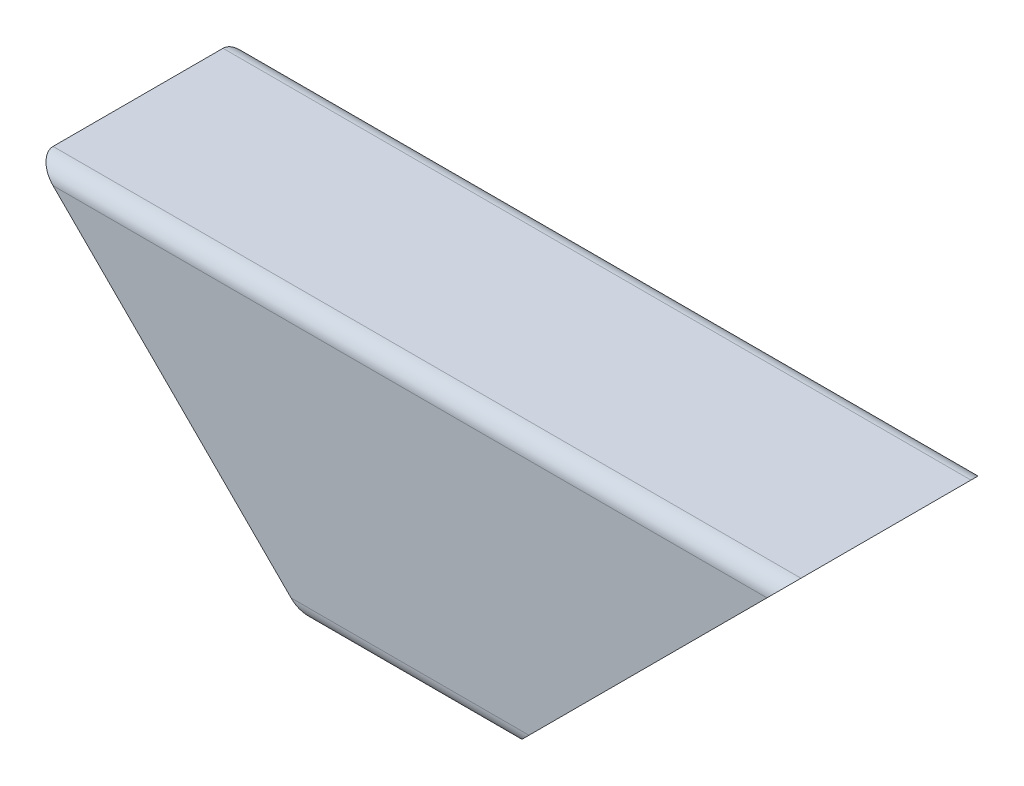
ISO-10303-21;
HEADER;
FILE_DESCRIPTION(('STEP AP214'),'2;1');
FILE_NAME('part.step','',(''),(''),'','','');
FILE_SCHEMA(('AUTOMOTIVE_DESIGN { 1 0 10303 214 1 1 1 1 }'));
ENDSEC;
DATA;
#1=APPLICATION_CONTEXT('core data for automotive mechanical design processes');
#2=APPLICATION_PROTOCOL_DEFINITION('international standard','automotive_design',2000,#1);
#3=PRODUCT_CONTEXT('',#1,'mechanical');
#4=PRODUCT('Part','Part','',(#3));
#5=PRODUCT_RELATED_PRODUCT_CATEGORY('part','',(#4));
#6=PRODUCT_DEFINITION_FORMATION('','',#4);
#7=PRODUCT_DEFINITION_CONTEXT('part definition',#1,'design');
#8=PRODUCT_DEFINITION('design','',#6,#7);
#9=PRODUCT_DEFINITION_SHAPE('','',#8);
#10=(LENGTH_UNIT() NAMED_UNIT(*) SI_UNIT(.MILLI.,.METRE.));
#11=(NAMED_UNIT(*) PLANE_ANGLE_UNIT() SI_UNIT($,.RADIAN.));
#12=(NAMED_UNIT(*) SI_UNIT($,.STERADIAN.) SOLID_ANGLE_UNIT());
#13=UNCERTAINTY_MEASURE_WITH_UNIT(LENGTH_MEASURE(1.E-05),#10,'distance_accuracy_value','');
#14=(GEOMETRIC_REPRESENTATION_CONTEXT(3) GLOBAL_UNCERTAINTY_ASSIGNED_CONTEXT((#13)) GLOBAL_UNIT_ASSIGNED_CONTEXT((#10,
#11,#12)) REPRESENTATION_CONTEXT('',''));
#15=CARTESIAN_POINT('',(0.,0.,0.));
#16=DIRECTION('',(0.,0.,1.));
#17=DIRECTION('',(1.,0.,0.));
#18=AXIS2_PLACEMENT_3D('',#15,#16,#17);
#19=CARTESIAN_POINT('',(139.7,34.2808256510846,71.6854824043168));
#20=DIRECTION('',(-1.,0.,0.));
#21=DIRECTION('',(0.,0.,1.));
#22=AXIS2_PLACEMENT_3D('',#19,#20,#21);
#23=CYLINDRICAL_SURFACE('',#22,3.175);
#24=DIRECTION('',(-1.,0.,0.));
#25=VECTOR('',#24,1.);
#26=CARTESIAN_POINT('',(139.7,34.2808256510845,74.8604824043168));
#27=LINE('',#26,#25);
#28=CARTESIAN_POINT('',(136.525,34.2808256510845,74.8604824043168));
#29=VERTEX_POINT('',#28);
#30=CARTESIAN_POINT('',(3.17499999999998,34.2808256510846,74.8604824043168));
#31=VERTEX_POINT('',#30);
#32=EDGE_CURVE('E212',#29,#31,#27,.T.);
#33=ORIENTED_EDGE('',*,*,#32,.F.);
#34=CARTESIAN_POINT('',(136.525,34.2808256510846,71.6854824043168));
#35=DIRECTION('',(-0.707106781186547,0.707106781186548,0.));
#36=DIRECTION('',(-0.707106781186548,-0.707106781186547,0.));
#37=AXIS2_PLACEMENT_3D('',#34,#35,#36);
#38=ELLIPSE('',#37,4.49012806053457,3.175);
#39=CARTESIAN_POINT('',(139.7,37.4558256510846,71.6854824043168));
#40=VERTEX_POINT('',#39);
#41=EDGE_CURVE('E194',#29,#40,#38,.T.);
#42=ORIENTED_EDGE('',*,*,#41,.T.);
#43=DIRECTION('',(-1.,0.,0.));
#44=VECTOR('',#43,1.);
#45=CARTESIAN_POINT('',(139.7,37.4558256510846,71.6854824043168));
#46=LINE('',#45,#44);
#47=CARTESIAN_POINT('',(0.,37.4558256510846,71.6854824043168));
#48=VERTEX_POINT('',#47);
#49=EDGE_CURVE('E234',#40,#48,#46,.T.);
#50=ORIENTED_EDGE('',*,*,#49,.T.);
#51=CARTESIAN_POINT('',(3.17499999999998,34.2808256510846,71.6854824043168));
#52=DIRECTION('',(0.707106781186547,0.707106781186548,0.));
#53=DIRECTION('',(-0.707106781186548,0.707106781186547,0.));
#54=AXIS2_PLACEMENT_3D('',#51,#52,#53);
#55=ELLIPSE('',#54,4.49012806053457,3.175);
#56=EDGE_CURVE('E218',#48,#31,#55,.T.);
#57=ORIENTED_EDGE('',*,*,#56,.T.);
#58=EDGE_LOOP('',(#33,#42,#50,#57));
#59=FACE_BOUND('',#58,.T.);
#60=ADVANCED_FACE('F82',(#59),#23,.T.);
#61=CARTESIAN_POINT('',(139.7,-10.1691743489154,74.8604824043168));
#62=DIRECTION('',(0.,0.,-1.));
#63=DIRECTION('',(-1.,0.,0.));
#64=AXIS2_PLACEMENT_3D('',#61,#62,#63);
#65=PLANE('',#64);
#66=DIRECTION('',(-1.,0.,0.));
#67=VECTOR('',#66,1.);
#68=CARTESIAN_POINT('',(139.7,-10.1691743489154,74.8604824043168));
#69=LINE('',#68,#67);
#70=CARTESIAN_POINT('',(92.075,-10.1691743489154,74.8604824043168));
#71=VERTEX_POINT('',#70);
#72=CARTESIAN_POINT('',(47.625,-10.1691743489154,74.8604824043168));
#73=VERTEX_POINT('',#72);
#74=EDGE_CURVE('E214',#71,#73,#69,.T.);
#75=ORIENTED_EDGE('',*,*,#74,.F.);
#76=DIRECTION('',(-0.707106781186548,-0.707106781186547,0.));
#77=VECTOR('',#76,1.);
#78=CARTESIAN_POINT('',(139.7,37.4558256510846,74.8604824043168));
#79=LINE('',#78,#77);
#80=EDGE_CURVE('E197',#29,#71,#79,.T.);
#81=ORIENTED_EDGE('',*,*,#80,.F.);
#82=ORIENTED_EDGE('',*,*,#32,.T.);
#83=DIRECTION('',(-0.707106781186548,0.707106781186547,0.));
#84=VECTOR('',#83,1.);
#85=CARTESIAN_POINT('',(76.2,-38.7441743489155,74.8604824043168));
#86=LINE('',#85,#84);
#87=EDGE_CURVE('E205',#73,#31,#86,.T.);
#88=ORIENTED_EDGE('',*,*,#87,.F.);
#89=EDGE_LOOP('',(#75,#81,#82,#88));
#90=FACE_BOUND('',#89,.T.);
#91=ADVANCED_FACE('F210',(#90),#65,.F.);
#92=CARTESIAN_POINT('',(139.7,-10.1691743489154,71.6854824043168));
#93=DIRECTION('',(-1.,0.,0.));
#94=DIRECTION('',(0.,0.,1.));
#95=AXIS2_PLACEMENT_3D('',#92,#93,#94);
#96=CYLINDRICAL_SURFACE('',#95,3.175);
#97=DIRECTION('',(-1.,0.,0.));
#98=VECTOR('',#97,1.);
#99=CARTESIAN_POINT('',(139.7,-13.3441743489154,71.6854824043168));
#100=LINE('',#99,#98);
#101=CARTESIAN_POINT('',(88.9,-13.3441743489154,71.6854824043168));
#102=VERTEX_POINT('',#101);
#103=CARTESIAN_POINT('',(50.8,-13.3441743489154,71.6854824043168));
#104=VERTEX_POINT('',#103);
#105=EDGE_CURVE('E221',#102,#104,#100,.T.);
#106=ORIENTED_EDGE('',*,*,#105,.F.);
#107=CARTESIAN_POINT('',(92.075,-10.1691743489154,71.6854824043168));
#108=DIRECTION('',(-0.707106781186547,0.707106781186548,0.));
#109=DIRECTION('',(-0.707106781186548,-0.707106781186547,0.));
#110=AXIS2_PLACEMENT_3D('',#107,#108,#109);
#111=ELLIPSE('',#110,4.49012806053458,3.175);
#112=EDGE_CURVE('E206',#102,#71,#111,.T.);
#113=ORIENTED_EDGE('',*,*,#112,.T.);
#114=ORIENTED_EDGE('',*,*,#74,.T.);
#115=CARTESIAN_POINT('',(47.625,-10.1691743489154,71.6854824043168));
#116=DIRECTION('',(0.707106781186547,0.707106781186548,0.));
#117=DIRECTION('',(-0.707106781186548,0.707106781186547,0.));
#118=AXIS2_PLACEMENT_3D('',#115,#116,#117);
#119=ELLIPSE('',#118,4.49012806053458,3.175);
#120=EDGE_CURVE('E256',#73,#104,#119,.T.);
#121=ORIENTED_EDGE('',*,*,#120,.T.);
#122=EDGE_LOOP('',(#106,#113,#114,#121));
#123=FACE_BOUND('',#122,.T.);
#124=ADVANCED_FACE('F334',(#123),#96,.T.);
#125=CARTESIAN_POINT('',(139.7,-13.3441743489154,71.6854824043168));
#126=DIRECTION('',(0.,1.,0.));
#127=DIRECTION('',(0.,0.,1.));
#128=AXIS2_PLACEMENT_3D('',#125,#126,#127);
#129=PLANE('',#128);
#130=DIRECTION('',(-1.,0.,0.));
#131=VECTOR('',#130,1.);
#132=CARTESIAN_POINT('',(139.7,-13.3441743489154,39.9354824043168));
#133=LINE('',#132,#131);
#134=CARTESIAN_POINT('',(88.9,-13.3441743489154,39.9354824043168));
#135=VERTEX_POINT('',#134);
#136=CARTESIAN_POINT('',(50.8,-13.3441743489154,39.9354824043168));
#137=VERTEX_POINT('',#136);
#138=EDGE_CURVE('E225',#135,#137,#133,.T.);
#139=ORIENTED_EDGE('',*,*,#138,.F.);
#140=DIRECTION('',(0.,0.,1.));
#141=VECTOR('',#140,1.);
#142=CARTESIAN_POINT('',(88.9,-13.3441743489154,71.6854824043168));
#143=LINE('',#142,#141);
#144=EDGE_CURVE('E293',#135,#102,#143,.T.);
#145=ORIENTED_EDGE('',*,*,#144,.T.);
#146=ORIENTED_EDGE('',*,*,#105,.T.);
#147=DIRECTION('',(0.,0.,-1.));
#148=VECTOR('',#147,1.);
#149=CARTESIAN_POINT('',(50.8,-13.3441743489154,71.6854824043168));
#150=LINE('',#149,#148);
#151=EDGE_CURVE('E259',#104,#137,#150,.T.);
#152=ORIENTED_EDGE('',*,*,#151,.T.);
#153=EDGE_LOOP('',(#139,#145,#146,#152));
#154=FACE_BOUND('',#153,.T.);
#155=ADVANCED_FACE('F331',(#154),#129,.F.);
#156=CARTESIAN_POINT('',(139.7,-10.1691743489154,39.9354824043168));
#157=DIRECTION('',(-1.,0.,0.));
#158=DIRECTION('',(0.,0.,1.));
#159=AXIS2_PLACEMENT_3D('',#156,#157,#158);
#160=CYLINDRICAL_SURFACE('',#159,3.175);
#161=DIRECTION('',(-1.,0.,0.));
#162=VECTOR('',#161,1.);
#163=CARTESIAN_POINT('',(139.7,-10.1691743489154,36.7604824043168));
#164=LINE('',#163,#162);
#165=CARTESIAN_POINT('',(92.075,-10.1691743489154,36.7604824043168));
#166=VERTEX_POINT('',#165);
#167=CARTESIAN_POINT('',(47.625,-10.1691743489154,36.7604824043168));
#168=VERTEX_POINT('',#167);
#169=EDGE_CURVE('E227',#166,#168,#164,.T.);
#170=ORIENTED_EDGE('',*,*,#169,.F.);
#171=CARTESIAN_POINT('',(92.075,-10.1691743489154,39.9354824043168));
#172=DIRECTION('',(-0.707106781186547,0.707106781186548,0.));
#173=DIRECTION('',(-0.707106781186548,-0.707106781186547,0.));
#174=AXIS2_PLACEMENT_3D('',#171,#172,#173);
#175=ELLIPSE('',#174,4.49012806053457,3.175);
#176=EDGE_CURVE('E296',#166,#135,#175,.T.);
#177=ORIENTED_EDGE('',*,*,#176,.T.);
#178=ORIENTED_EDGE('',*,*,#138,.T.);
#179=CARTESIAN_POINT('',(47.625,-10.1691743489154,39.9354824043168));
#180=DIRECTION('',(0.707106781186547,0.707106781186548,0.));
#181=DIRECTION('',(-0.707106781186548,0.707106781186547,0.));
#182=AXIS2_PLACEMENT_3D('',#179,#180,#181);
#183=ELLIPSE('',#182,4.49012806053457,3.175);
#184=EDGE_CURVE('E262',#137,#168,#183,.T.);
#185=ORIENTED_EDGE('',*,*,#184,.T.);
#186=EDGE_LOOP('',(#170,#177,#178,#185));
#187=FACE_BOUND('',#186,.T.);
#188=ADVANCED_FACE('F322',(#187),#160,.T.);
#189=CARTESIAN_POINT('',(139.7,-10.1691743489154,36.7604824043168));
#190=DIRECTION('',(0.,0.,1.));
#191=DIRECTION('',(1.,0.,0.));
#192=AXIS2_PLACEMENT_3D('',#189,#190,#191);
#193=PLANE('',#192);
#194=DIRECTION('',(-1.,0.,0.));
#195=VECTOR('',#194,1.);
#196=CARTESIAN_POINT('',(139.7,34.2808256510845,36.7604824043168));
#197=LINE('',#196,#195);
#198=CARTESIAN_POINT('',(136.525,34.2808256510846,36.7604824043168));
#199=VERTEX_POINT('',#198);
#200=CARTESIAN_POINT('',(3.17499999999998,34.2808256510846,36.7604824043168));
#201=VERTEX_POINT('',#200);
#202=EDGE_CURVE('E229',#199,#201,#197,.T.);
#203=ORIENTED_EDGE('',*,*,#202,.F.);
#204=DIRECTION('',(-0.707106781186548,-0.707106781186547,0.));
#205=VECTOR('',#204,1.);
#206=CARTESIAN_POINT('',(139.7,37.4558256510846,36.7604824043168));
#207=LINE('',#206,#205);
#208=EDGE_CURVE('E215',#199,#166,#207,.T.);
#209=ORIENTED_EDGE('',*,*,#208,.T.);
#210=ORIENTED_EDGE('',*,*,#169,.T.);
#211=DIRECTION('',(-0.707106781186548,0.707106781186547,0.));
#212=VECTOR('',#211,1.);
#213=CARTESIAN_POINT('',(76.2,-38.7441743489155,36.7604824043168));
#214=LINE('',#213,#212);
#215=EDGE_CURVE('E288',#168,#201,#214,.T.);
#216=ORIENTED_EDGE('',*,*,#215,.T.);
#217=EDGE_LOOP('',(#203,#209,#210,#216));
#218=FACE_BOUND('',#217,.T.);
#219=ADVANCED_FACE('F319',(#218),#193,.F.);
#220=CARTESIAN_POINT('',(139.7,34.2808256510846,39.9354824043168));
#221=DIRECTION('',(-1.,0.,0.));
#222=DIRECTION('',(0.,0.,1.));
#223=AXIS2_PLACEMENT_3D('',#220,#221,#222);
#224=CYLINDRICAL_SURFACE('',#223,3.175);
#225=DIRECTION('',(-1.,0.,0.));
#226=VECTOR('',#225,1.);
#227=CARTESIAN_POINT('',(139.7,37.4558256510846,39.9354824043168));
#228=LINE('',#227,#226);
#229=CARTESIAN_POINT('',(139.7,37.4558256510846,39.9354824043168));
#230=VERTEX_POINT('',#229);
#231=CARTESIAN_POINT('',(0.,37.4558256510846,39.9354824043168));
#232=VERTEX_POINT('',#231);
#233=EDGE_CURVE('E231',#230,#232,#228,.T.);
#234=ORIENTED_EDGE('',*,*,#233,.F.);
#235=CARTESIAN_POINT('',(136.525,34.2808256510846,39.9354824043168));
#236=DIRECTION('',(-0.707106781186547,0.707106781186548,0.));
#237=DIRECTION('',(-0.707106781186548,-0.707106781186547,0.));
#238=AXIS2_PLACEMENT_3D('',#235,#236,#237);
#239=ELLIPSE('',#238,4.49012806053457,3.175);
#240=EDGE_CURVE('E299',#230,#199,#239,.T.);
#241=ORIENTED_EDGE('',*,*,#240,.T.);
#242=ORIENTED_EDGE('',*,*,#202,.T.);
#243=CARTESIAN_POINT('',(3.17499999999998,34.2808256510846,39.9354824043168));
#244=DIRECTION('',(0.707106781186547,0.707106781186548,0.));
#245=DIRECTION('',(-0.707106781186548,0.707106781186547,0.));
#246=AXIS2_PLACEMENT_3D('',#243,#244,#245);
#247=ELLIPSE('',#246,4.49012806053457,3.175);
#248=EDGE_CURVE('E265',#201,#232,#247,.T.);
#249=ORIENTED_EDGE('',*,*,#248,.T.);
#250=EDGE_LOOP('',(#234,#241,#242,#249));
#251=FACE_BOUND('',#250,.T.);
#252=ADVANCED_FACE('F339',(#251),#224,.T.);
#253=CARTESIAN_POINT('',(139.7,37.4558256510846,71.6854824043168));
#254=DIRECTION('',(0.,-1.,0.));
#255=DIRECTION('',(0.,0.,-1.));
#256=AXIS2_PLACEMENT_3D('',#253,#254,#255);
#257=PLANE('',#256);
#258=DIRECTION('',(0.,0.,1.));
#259=VECTOR('',#258,1.);
#260=CARTESIAN_POINT('',(0.,37.4558256510846,71.6854824043168));
#261=LINE('',#260,#259);
#262=EDGE_CURVE('E236',#232,#48,#261,.T.);
#263=ORIENTED_EDGE('',*,*,#262,.T.);
#264=ORIENTED_EDGE('',*,*,#49,.F.);
#265=DIRECTION('',(0.,0.,1.));
#266=VECTOR('',#265,1.);
#267=CARTESIAN_POINT('',(139.7,37.4558256510846,71.6854824043168));
#268=LINE('',#267,#266);
#269=EDGE_CURVE('E200',#230,#40,#268,.T.);
#270=ORIENTED_EDGE('',*,*,#269,.F.);
#271=ORIENTED_EDGE('',*,*,#233,.T.);
#272=EDGE_LOOP('',(#263,#264,#270,#271));
#273=FACE_BOUND('',#272,.T.);
#274=ADVANCED_FACE('F336',(#273),#257,.F.);
#275=CARTESIAN_POINT('',(139.7,34.2808256510846,71.6854824043168));
#276=DIRECTION('',(-1.,0.,0.));
#277=DIRECTION('',(0.,0.,1.));
#278=AXIS2_PLACEMENT_3D('',#275,#276,#277);
#279=CYLINDRICAL_SURFACE('',#278,1.524);
#280=CARTESIAN_POINT('',(136.525,34.2808256510846,71.6854824043168));
#281=DIRECTION('',(-0.707106781186547,0.707106781186548,0.));
#282=DIRECTION('',(-0.707106781186548,-0.707106781186547,0.));
#283=AXIS2_PLACEMENT_3D('',#280,#281,#282);
#284=ELLIPSE('',#283,2.15526146905659,1.524);
#285=CARTESIAN_POINT('',(136.525,34.2808256510845,73.2094824043168));
#286=VERTEX_POINT('',#285);
#287=CARTESIAN_POINT('',(138.049,35.8048256510846,71.6854824043168));
#288=VERTEX_POINT('',#287);
#289=EDGE_CURVE('E95',#286,#288,#284,.T.);
#290=ORIENTED_EDGE('',*,*,#289,.F.);
#291=DIRECTION('',(-1.,0.,0.));
#292=VECTOR('',#291,1.);
#293=CARTESIAN_POINT('',(139.7,34.2808256510845,73.2094824043168));
#294=LINE('',#293,#292);
#295=CARTESIAN_POINT('',(3.17500000000004,34.2808256510845,73.2094824043168));
#296=VERTEX_POINT('',#295);
#297=EDGE_CURVE('E239',#286,#296,#294,.T.);
#298=ORIENTED_EDGE('',*,*,#297,.T.);
#299=CARTESIAN_POINT('',(3.17499999999998,34.2808256510846,71.6854824043168));
#300=DIRECTION('',(0.707106781186547,0.707106781186548,0.));
#301=DIRECTION('',(-0.707106781186548,0.707106781186547,0.));
#302=AXIS2_PLACEMENT_3D('',#299,#300,#301);
#303=ELLIPSE('',#302,2.15526146905659,1.524);
#304=CARTESIAN_POINT('',(1.65099999999999,35.8048256510846,71.6854824043168));
#305=VERTEX_POINT('',#304);
#306=EDGE_CURVE('E268',#305,#296,#303,.T.);
#307=ORIENTED_EDGE('',*,*,#306,.F.);
#308=DIRECTION('',(-1.,0.,0.));
#309=VECTOR('',#308,1.);
#310=CARTESIAN_POINT('',(139.7,35.8048256510846,71.6854824043168));
#311=LINE('',#310,#309);
#312=EDGE_CURVE('E253',#288,#305,#311,.T.);
#313=ORIENTED_EDGE('',*,*,#312,.F.);
#314=EDGE_LOOP('',(#290,#298,#307,#313));
#315=FACE_BOUND('',#314,.T.);
#316=ADVANCED_FACE('F346',(#315),#279,.F.);
#317=CARTESIAN_POINT('',(139.7,34.2808256510846,73.2094824043168));
#318=DIRECTION('',(0.,0.,-1.));
#319=DIRECTION('',(-1.,0.,0.));
#320=AXIS2_PLACEMENT_3D('',#317,#318,#319);
#321=PLANE('',#320);
#322=DIRECTION('',(0.707106781186548,0.707106781186547,0.));
#323=VECTOR('',#322,1.);
#324=CARTESIAN_POINT('',(138.1125,35.8683256510846,73.2094824043168));
#325=LINE('',#324,#323);
#326=CARTESIAN_POINT('',(92.075,-10.1691743489154,73.2094824043168));
#327=VERTEX_POINT('',#326);
#328=EDGE_CURVE('E303',#327,#286,#325,.T.);
#329=ORIENTED_EDGE('',*,*,#328,.F.);
#330=DIRECTION('',(-1.,0.,0.));
#331=VECTOR('',#330,1.);
#332=CARTESIAN_POINT('',(139.7,-10.1691743489154,73.2094824043168));
#333=LINE('',#332,#331);
#334=CARTESIAN_POINT('',(47.625,-10.1691743489154,73.2094824043168));
#335=VERTEX_POINT('',#334);
#336=EDGE_CURVE('E242',#327,#335,#333,.T.);
#337=ORIENTED_EDGE('',*,*,#336,.T.);
#338=DIRECTION('',(0.707106781186548,-0.707106781186547,0.));
#339=VECTOR('',#338,1.);
#340=CARTESIAN_POINT('',(71.4375,-33.9816743489154,73.2094824043168));
#341=LINE('',#340,#339);
#342=EDGE_CURVE('E271',#296,#335,#341,.T.);
#343=ORIENTED_EDGE('',*,*,#342,.F.);
#344=ORIENTED_EDGE('',*,*,#297,.F.);
#345=EDGE_LOOP('',(#329,#337,#343,#344));
#346=FACE_BOUND('',#345,.T.);
#347=ADVANCED_FACE('F388',(#346),#321,.T.);
#348=CARTESIAN_POINT('',(139.7,-10.1691743489154,71.6854824043168));
#349=DIRECTION('',(-1.,0.,0.));
#350=DIRECTION('',(0.,0.,1.));
#351=AXIS2_PLACEMENT_3D('',#348,#349,#350);
#352=CYLINDRICAL_SURFACE('',#351,1.524);
#353=CARTESIAN_POINT('',(92.075,-10.1691743489154,71.6854824043168));
#354=DIRECTION('',(-0.707106781186547,0.707106781186548,0.));
#355=DIRECTION('',(-0.707106781186548,-0.707106781186547,0.));
#356=AXIS2_PLACEMENT_3D('',#353,#354,#355);
#357=ELLIPSE('',#356,2.1552614690566,1.524);
#358=CARTESIAN_POINT('',(90.551,-11.6931743489154,71.6854824043168));
#359=VERTEX_POINT('',#358);
#360=EDGE_CURVE('E305',#359,#327,#357,.T.);
#361=ORIENTED_EDGE('',*,*,#360,.F.);
#362=DIRECTION('',(-1.,0.,0.));
#363=VECTOR('',#362,1.);
#364=CARTESIAN_POINT('',(139.7,-11.6931743489154,71.6854824043168));
#365=LINE('',#364,#363);
#366=CARTESIAN_POINT('',(49.149,-11.6931743489154,71.6854824043168));
#367=VERTEX_POINT('',#366);
#368=EDGE_CURVE('E244',#359,#367,#365,.T.);
#369=ORIENTED_EDGE('',*,*,#368,.T.);
#370=CARTESIAN_POINT('',(47.625,-10.1691743489154,71.6854824043168));
#371=DIRECTION('',(0.707106781186547,0.707106781186548,0.));
#372=DIRECTION('',(-0.707106781186548,0.707106781186547,0.));
#373=AXIS2_PLACEMENT_3D('',#370,#371,#372);
#374=ELLIPSE('',#373,2.1552614690566,1.524);
#375=EDGE_CURVE('E274',#335,#367,#374,.T.);
#376=ORIENTED_EDGE('',*,*,#375,.F.);
#377=ORIENTED_EDGE('',*,*,#336,.F.);
#378=EDGE_LOOP('',(#361,#369,#376,#377));
#379=FACE_BOUND('',#378,.T.);
#380=ADVANCED_FACE('F398',(#379),#352,.F.);
#381=CARTESIAN_POINT('',(139.7,-11.6931743489154,71.6854824043168));
#382=DIRECTION('',(0.,1.,0.));
#383=DIRECTION('',(0.,0.,1.));
#384=AXIS2_PLACEMENT_3D('',#381,#382,#383);
#385=PLANE('',#384);
#386=DIRECTION('',(0.,0.,1.));
#387=VECTOR('',#386,1.);
#388=CARTESIAN_POINT('',(90.551,-11.6931743489154,71.6854824043168));
#389=LINE('',#388,#387);
#390=CARTESIAN_POINT('',(90.551,-11.6931743489154,39.9354824043168));
#391=VERTEX_POINT('',#390);
#392=EDGE_CURVE('E307',#391,#359,#389,.T.);
#393=ORIENTED_EDGE('',*,*,#392,.F.);
#394=DIRECTION('',(-1.,0.,0.));
#395=VECTOR('',#394,1.);
#396=CARTESIAN_POINT('',(139.7,-11.6931743489154,39.9354824043168));
#397=LINE('',#396,#395);
#398=CARTESIAN_POINT('',(49.149,-11.6931743489154,39.9354824043168));
#399=VERTEX_POINT('',#398);
#400=EDGE_CURVE('E246',#391,#399,#397,.T.);
#401=ORIENTED_EDGE('',*,*,#400,.T.);
#402=DIRECTION('',(0.,0.,-1.));
#403=VECTOR('',#402,1.);
#404=CARTESIAN_POINT('',(49.149,-11.6931743489154,71.6854824043168));
#405=LINE('',#404,#403);
#406=EDGE_CURVE('E277',#367,#399,#405,.T.);
#407=ORIENTED_EDGE('',*,*,#406,.F.);
#408=ORIENTED_EDGE('',*,*,#368,.F.);
#409=EDGE_LOOP('',(#393,#401,#407,#408));
#410=FACE_BOUND('',#409,.T.);
#411=ADVANCED_FACE('F408',(#410),#385,.T.);
#412=CARTESIAN_POINT('',(139.7,-10.1691743489154,39.9354824043168));
#413=DIRECTION('',(-1.,0.,0.));
#414=DIRECTION('',(0.,0.,1.));
#415=AXIS2_PLACEMENT_3D('',#412,#413,#414);
#416=CYLINDRICAL_SURFACE('',#415,1.524);
#417=CARTESIAN_POINT('',(92.075,-10.1691743489154,39.9354824043168));
#418=DIRECTION('',(-0.707106781186547,0.707106781186548,0.));
#419=DIRECTION('',(-0.707106781186548,-0.707106781186547,0.));
#420=AXIS2_PLACEMENT_3D('',#417,#418,#419);
#421=ELLIPSE('',#420,2.15526146905659,1.524);
#422=CARTESIAN_POINT('',(92.075,-10.1691743489154,38.4114824043168));
#423=VERTEX_POINT('',#422);
#424=EDGE_CURVE('E309',#423,#391,#421,.T.);
#425=ORIENTED_EDGE('',*,*,#424,.F.);
#426=DIRECTION('',(-1.,0.,0.));
#427=VECTOR('',#426,1.);
#428=CARTESIAN_POINT('',(139.7,-10.1691743489154,38.4114824043168));
#429=LINE('',#428,#427);
#430=CARTESIAN_POINT('',(47.625,-10.1691743489154,38.4114824043168));
#431=VERTEX_POINT('',#430);
#432=EDGE_CURVE('E248',#423,#431,#429,.T.);
#433=ORIENTED_EDGE('',*,*,#432,.T.);
#434=CARTESIAN_POINT('',(47.625,-10.1691743489154,39.9354824043168));
#435=DIRECTION('',(0.707106781186547,0.707106781186548,0.));
#436=DIRECTION('',(-0.707106781186548,0.707106781186547,0.));
#437=AXIS2_PLACEMENT_3D('',#434,#435,#436);
#438=ELLIPSE('',#437,2.15526146905659,1.524);
#439=EDGE_CURVE('E280',#399,#431,#438,.T.);
#440=ORIENTED_EDGE('',*,*,#439,.F.);
#441=ORIENTED_EDGE('',*,*,#400,.F.);
#442=EDGE_LOOP('',(#425,#433,#440,#441));
#443=FACE_BOUND('',#442,.T.);
#444=ADVANCED_FACE('F418',(#443),#416,.F.);
#445=CARTESIAN_POINT('',(139.7,34.2808256510846,38.4114824043168));
#446=DIRECTION('',(0.,0.,1.));
#447=DIRECTION('',(1.,0.,0.));
#448=AXIS2_PLACEMENT_3D('',#445,#446,#447);
#449=PLANE('',#448);
#450=DIRECTION('',(-0.707106781186548,-0.707106781186547,0.));
#451=VECTOR('',#450,1.);
#452=CARTESIAN_POINT('',(138.1125,35.8683256510846,38.4114824043168));
#453=LINE('',#452,#451);
#454=CARTESIAN_POINT('',(136.525,34.2808256510845,38.4114824043168));
#455=VERTEX_POINT('',#454);
#456=EDGE_CURVE('E311',#455,#423,#453,.T.);
#457=ORIENTED_EDGE('',*,*,#456,.F.);
#458=DIRECTION('',(-1.,0.,0.));
#459=VECTOR('',#458,1.);
#460=CARTESIAN_POINT('',(139.7,34.2808256510845,38.4114824043168));
#461=LINE('',#460,#459);
#462=CARTESIAN_POINT('',(3.17500000000001,34.2808256510845,38.4114824043168));
#463=VERTEX_POINT('',#462);
#464=EDGE_CURVE('E250',#455,#463,#461,.T.);
#465=ORIENTED_EDGE('',*,*,#464,.T.);
#466=DIRECTION('',(-0.707106781186548,0.707106781186547,0.));
#467=VECTOR('',#466,1.);
#468=CARTESIAN_POINT('',(71.4375,-33.9816743489154,38.4114824043168));
#469=LINE('',#468,#467);
#470=EDGE_CURVE('E283',#431,#463,#469,.T.);
#471=ORIENTED_EDGE('',*,*,#470,.F.);
#472=ORIENTED_EDGE('',*,*,#432,.F.);
#473=EDGE_LOOP('',(#457,#465,#471,#472));
#474=FACE_BOUND('',#473,.T.);
#475=ADVANCED_FACE('F428',(#474),#449,.T.);
#476=CARTESIAN_POINT('',(139.7,34.2808256510846,39.9354824043168));
#477=DIRECTION('',(-1.,0.,0.));
#478=DIRECTION('',(0.,0.,1.));
#479=AXIS2_PLACEMENT_3D('',#476,#477,#478);
#480=CYLINDRICAL_SURFACE('',#479,1.524);
#481=CARTESIAN_POINT('',(136.525,34.2808256510846,39.9354824043168));
#482=DIRECTION('',(-0.707106781186547,0.707106781186548,0.));
#483=DIRECTION('',(-0.707106781186548,-0.707106781186547,0.));
#484=AXIS2_PLACEMENT_3D('',#481,#482,#483);
#485=ELLIPSE('',#484,2.15526146905659,1.524);
#486=CARTESIAN_POINT('',(138.049,35.8048256510846,39.9354824043168));
#487=VERTEX_POINT('',#486);
#488=EDGE_CURVE('E313',#487,#455,#485,.T.);
#489=ORIENTED_EDGE('',*,*,#488,.F.);
#490=DIRECTION('',(-1.,0.,0.));
#491=VECTOR('',#490,1.);
#492=CARTESIAN_POINT('',(139.7,35.8048256510846,39.9354824043168));
#493=LINE('',#492,#491);
#494=CARTESIAN_POINT('',(1.65099999999999,35.8048256510846,39.9354824043168));
#495=VERTEX_POINT('',#494);
#496=EDGE_CURVE('E103',#487,#495,#493,.T.);
#497=ORIENTED_EDGE('',*,*,#496,.T.);
#498=CARTESIAN_POINT('',(3.17499999999998,34.2808256510846,39.9354824043168));
#499=DIRECTION('',(0.707106781186547,0.707106781186548,0.));
#500=DIRECTION('',(-0.707106781186548,0.707106781186547,0.));
#501=AXIS2_PLACEMENT_3D('',#498,#499,#500);
#502=ELLIPSE('',#501,2.15526146905659,1.524);
#503=EDGE_CURVE('E286',#463,#495,#502,.T.);
#504=ORIENTED_EDGE('',*,*,#503,.F.);
#505=ORIENTED_EDGE('',*,*,#464,.F.);
#506=EDGE_LOOP('',(#489,#497,#504,#505));
#507=FACE_BOUND('',#506,.T.);
#508=ADVANCED_FACE('F438',(#507),#480,.F.);
#509=CARTESIAN_POINT('',(139.7,35.8048256510846,71.6854824043168));
#510=DIRECTION('',(0.,-1.,0.));
#511=DIRECTION('',(0.,0.,-1.));
#512=AXIS2_PLACEMENT_3D('',#509,#510,#511);
#513=PLANE('',#512);
#514=DIRECTION('',(0.,0.,-1.));
#515=VECTOR('',#514,1.);
#516=CARTESIAN_POINT('',(138.049,35.8048256510846,71.6854824043168));
#517=LINE('',#516,#515);
#518=EDGE_CURVE('E12',#288,#487,#517,.T.);
#519=ORIENTED_EDGE('',*,*,#518,.F.);
#520=ORIENTED_EDGE('',*,*,#312,.T.);
#521=DIRECTION('',(0.,0.,1.));
#522=VECTOR('',#521,1.);
#523=CARTESIAN_POINT('',(1.65099999999999,35.8048256510846,71.6854824043168));
#524=LINE('',#523,#522);
#525=EDGE_CURVE('E89',#495,#305,#524,.T.);
#526=ORIENTED_EDGE('',*,*,#525,.F.);
#527=ORIENTED_EDGE('',*,*,#496,.F.);
#528=EDGE_LOOP('',(#519,#520,#526,#527));
#529=FACE_BOUND('',#528,.T.);
#530=ADVANCED_FACE('F448',(#529),#513,.T.);
#531=CARTESIAN_POINT('',(76.2,-38.7441743489155,36.7604824043168));
#532=DIRECTION('',(0.707106781186547,0.707106781186548,0.));
#533=DIRECTION('',(-0.707106781186548,0.707106781186547,0.));
#534=AXIS2_PLACEMENT_3D('',#531,#532,#533);
#535=PLANE('',#534);
#536=ORIENTED_EDGE('',*,*,#306,.T.);
#537=ORIENTED_EDGE('',*,*,#342,.T.);
#538=ORIENTED_EDGE('',*,*,#375,.T.);
#539=ORIENTED_EDGE('',*,*,#406,.T.);
#540=ORIENTED_EDGE('',*,*,#439,.T.);
#541=ORIENTED_EDGE('',*,*,#470,.T.);
#542=ORIENTED_EDGE('',*,*,#503,.T.);
#543=ORIENTED_EDGE('',*,*,#525,.T.);
#544=EDGE_LOOP('',(#536,#537,#538,#539,#540,#541,#542,#543));
#545=FACE_BOUND('',#544,.T.);
#546=ORIENTED_EDGE('',*,*,#262,.F.);
#547=ORIENTED_EDGE('',*,*,#248,.F.);
#548=ORIENTED_EDGE('',*,*,#215,.F.);
#549=ORIENTED_EDGE('',*,*,#184,.F.);
#550=ORIENTED_EDGE('',*,*,#151,.F.);
#551=ORIENTED_EDGE('',*,*,#120,.F.);
#552=ORIENTED_EDGE('',*,*,#87,.T.);
#553=ORIENTED_EDGE('',*,*,#56,.F.);
#554=EDGE_LOOP('',(#546,#547,#548,#549,#550,#551,#552,#553));
#555=FACE_BOUND('',#554,.T.);
#556=ADVANCED_FACE('F327',(#545,#555),#535,.F.);
#557=CARTESIAN_POINT('',(139.7,37.4558256510846,36.7604824043168));
#558=DIRECTION('',(-0.707106781186547,0.707106781186548,0.));
#559=DIRECTION('',(-0.707106781186548,-0.707106781186547,0.));
#560=AXIS2_PLACEMENT_3D('',#557,#558,#559);
#561=PLANE('',#560);
#562=ORIENTED_EDGE('',*,*,#289,.T.);
#563=ORIENTED_EDGE('',*,*,#518,.T.);
#564=ORIENTED_EDGE('',*,*,#488,.T.);
#565=ORIENTED_EDGE('',*,*,#456,.T.);
#566=ORIENTED_EDGE('',*,*,#424,.T.);
#567=ORIENTED_EDGE('',*,*,#392,.T.);
#568=ORIENTED_EDGE('',*,*,#360,.T.);
#569=ORIENTED_EDGE('',*,*,#328,.T.);
#570=EDGE_LOOP('',(#562,#563,#564,#565,#566,#567,#568,#569));
#571=FACE_BOUND('',#570,.T.);
#572=ORIENTED_EDGE('',*,*,#80,.T.);
#573=ORIENTED_EDGE('',*,*,#112,.F.);
#574=ORIENTED_EDGE('',*,*,#144,.F.);
#575=ORIENTED_EDGE('',*,*,#176,.F.);
#576=ORIENTED_EDGE('',*,*,#208,.F.);
#577=ORIENTED_EDGE('',*,*,#240,.F.);
#578=ORIENTED_EDGE('',*,*,#269,.T.);
#579=ORIENTED_EDGE('',*,*,#41,.F.);
#580=EDGE_LOOP('',(#572,#573,#574,#575,#576,#577,#578,#579));
#581=FACE_BOUND('',#580,.T.);
#582=ADVANCED_FACE('F196',(#571,#581),#561,.F.);
#583=CLOSED_SHELL('',(#60,#91,#124,#155,#188,#219,#252,#274,#316,#347,#380,#411,#444,#475,#508,
#530,#556,#582));
#584=MANIFOLD_SOLID_BREP('B2',#583);
#585=ADVANCED_BREP_SHAPE_REPRESENTATION('',(#18,#584),#14);
#586=SHAPE_DEFINITION_REPRESENTATION(#9,#585);
ENDSEC;
END-ISO-10303-21;
